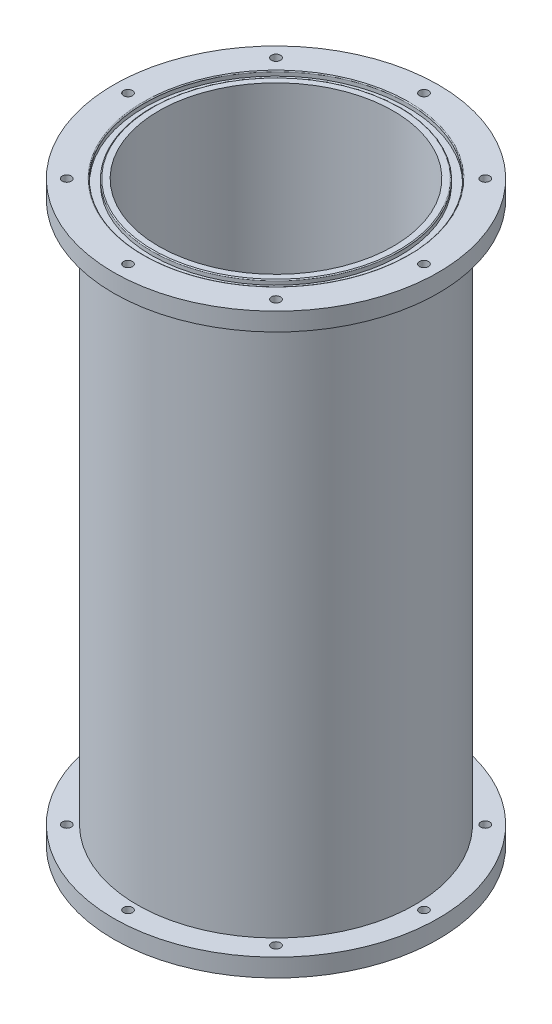
ISO-10303-21;
HEADER;
FILE_DESCRIPTION(('STEP AP214'),'2;1');
FILE_NAME('part.step','',(''),(''),'','','');
FILE_SCHEMA(('AUTOMOTIVE_DESIGN { 1 0 10303 214 1 1 1 1 }'));
ENDSEC;
DATA;
#1=APPLICATION_CONTEXT('core data for automotive mechanical design processes');
#2=APPLICATION_PROTOCOL_DEFINITION('international standard','automotive_design',2000,#1);
#3=PRODUCT_CONTEXT('',#1,'mechanical');
#4=PRODUCT('Part','Part','',(#3));
#5=PRODUCT_RELATED_PRODUCT_CATEGORY('part','',(#4));
#6=PRODUCT_DEFINITION_FORMATION('','',#4);
#7=PRODUCT_DEFINITION_CONTEXT('part definition',#1,'design');
#8=PRODUCT_DEFINITION('design','',#6,#7);
#9=PRODUCT_DEFINITION_SHAPE('','',#8);
#10=(LENGTH_UNIT() NAMED_UNIT(*) SI_UNIT(.MILLI.,.METRE.));
#11=(NAMED_UNIT(*) PLANE_ANGLE_UNIT() SI_UNIT($,.RADIAN.));
#12=(NAMED_UNIT(*) SI_UNIT($,.STERADIAN.) SOLID_ANGLE_UNIT());
#13=UNCERTAINTY_MEASURE_WITH_UNIT(LENGTH_MEASURE(1.E-05),#10,'distance_accuracy_value','');
#14=(GEOMETRIC_REPRESENTATION_CONTEXT(3) GLOBAL_UNCERTAINTY_ASSIGNED_CONTEXT((#13)) GLOBAL_UNIT_ASSIGNED_CONTEXT((#10,
#11,#12)) REPRESENTATION_CONTEXT('',''));
#15=CARTESIAN_POINT('',(0.,0.,0.));
#16=DIRECTION('',(0.,0.,1.));
#17=DIRECTION('',(1.,0.,0.));
#18=AXIS2_PLACEMENT_3D('',#15,#16,#17);
#19=CARTESIAN_POINT('',(0.,155.,0.));
#20=DIRECTION('',(0.,1.,0.));
#21=DIRECTION('',(0.,0.,-1.));
#22=AXIS2_PLACEMENT_3D('',#19,#20,#21);
#23=PLANE('',#22);
#24=CARTESIAN_POINT('',(41.,155.,0.));
#25=DIRECTION('',(0.,1.,0.));
#26=DIRECTION('',(0.,0.,1.));
#27=AXIS2_PLACEMENT_3D('',#24,#25,#26);
#28=CIRCLE('',#27,1.24999999999998);
#29=CARTESIAN_POINT('',(41.,155.,1.24999999999998));
#30=VERTEX_POINT('',#29);
#31=EDGE_CURVE('E272',#30,#30,#28,.F.);
#32=ORIENTED_EDGE('',*,*,#31,.F.);
#33=EDGE_LOOP('',(#32));
#34=FACE_BOUND('',#33,.T.);
#35=CARTESIAN_POINT('',(28.9913780286484,155.,28.9913780286485));
#36=DIRECTION('',(0.,1.,0.));
#37=DIRECTION('',(0.,0.,1.));
#38=AXIS2_PLACEMENT_3D('',#35,#36,#37);
#39=CIRCLE('',#38,1.24999999999998);
#40=CARTESIAN_POINT('',(28.9913780286484,155.,30.2413780286485));
#41=VERTEX_POINT('',#40);
#42=EDGE_CURVE('E264',#41,#41,#39,.F.);
#43=ORIENTED_EDGE('',*,*,#42,.F.);
#44=EDGE_LOOP('',(#43));
#45=FACE_BOUND('',#44,.T.);
#46=CARTESIAN_POINT('',(-28.9913780286486,155.,28.9913780286483));
#47=DIRECTION('',(0.,1.,0.));
#48=DIRECTION('',(0.,0.,1.));
#49=AXIS2_PLACEMENT_3D('',#46,#47,#48);
#50=CIRCLE('',#49,1.24999999999999);
#51=CARTESIAN_POINT('',(-28.9913780286486,155.,30.2413780286483));
#52=VERTEX_POINT('',#51);
#53=EDGE_CURVE('E248',#52,#52,#50,.F.);
#54=ORIENTED_EDGE('',*,*,#53,.F.);
#55=EDGE_LOOP('',(#54));
#56=FACE_BOUND('',#55,.T.);
#57=CARTESIAN_POINT('',(-28.9913780286482,155.,-28.9913780286487));
#58=DIRECTION('',(0.,1.,0.));
#59=DIRECTION('',(0.,0.,1.));
#60=AXIS2_PLACEMENT_3D('',#57,#58,#59);
#61=CIRCLE('',#60,1.24999999999998);
#62=CARTESIAN_POINT('',(-28.9913780286482,155.,-27.7413780286487));
#63=VERTEX_POINT('',#62);
#64=EDGE_CURVE('E232',#63,#63,#61,.F.);
#65=ORIENTED_EDGE('',*,*,#64,.F.);
#66=EDGE_LOOP('',(#65));
#67=FACE_BOUND('',#66,.T.);
#68=CARTESIAN_POINT('',(0.,155.,0.));
#69=DIRECTION('',(0.,1.,0.));
#70=DIRECTION('',(0.,0.,1.));
#71=AXIS2_PLACEMENT_3D('',#68,#69,#70);
#72=CIRCLE('',#71,38.5);
#73=CARTESIAN_POINT('',(0.,155.,38.5));
#74=VERTEX_POINT('',#73);
#75=EDGE_CURVE('E107',#74,#74,#72,.T.);
#76=ORIENTED_EDGE('',*,*,#75,.T.);
#77=EDGE_LOOP('',(#76));
#78=FACE_BOUND('',#77,.T.);
#79=CARTESIAN_POINT('',(0.,155.,0.));
#80=DIRECTION('',(0.,-1.,0.));
#81=DIRECTION('',(0.,0.,-1.));
#82=AXIS2_PLACEMENT_3D('',#79,#80,#81);
#83=CIRCLE('',#82,45.);
#84=CARTESIAN_POINT('',(0.,155.,-45.));
#85=VERTEX_POINT('',#84);
#86=EDGE_CURVE('E131',#85,#85,#83,.T.);
#87=ORIENTED_EDGE('',*,*,#86,.T.);
#88=EDGE_LOOP('',(#87));
#89=FACE_BOUND('',#88,.T.);
#90=CARTESIAN_POINT('',(28.9913780286488,155.,-28.9913780286481));
#91=DIRECTION('',(0.,1.,0.));
#92=DIRECTION('',(0.,0.,1.));
#93=AXIS2_PLACEMENT_3D('',#90,#91,#92);
#94=CIRCLE('',#93,1.24999999999998);
#95=CARTESIAN_POINT('',(28.9913780286488,155.,-27.7413780286481));
#96=VERTEX_POINT('',#95);
#97=EDGE_CURVE('E216',#96,#96,#94,.F.);
#98=ORIENTED_EDGE('',*,*,#97,.F.);
#99=EDGE_LOOP('',(#98));
#100=FACE_BOUND('',#99,.T.);
#101=CARTESIAN_POINT('',(4.29452204677705E-13,155.,-41.));
#102=DIRECTION('',(0.,1.,0.));
#103=DIRECTION('',(0.,0.,1.));
#104=AXIS2_PLACEMENT_3D('',#101,#102,#103);
#105=CIRCLE('',#104,1.24999999999998);
#106=CARTESIAN_POINT('',(4.29452204677705E-13,155.,-39.75));
#107=VERTEX_POINT('',#106);
#108=EDGE_CURVE('E224',#107,#107,#105,.F.);
#109=ORIENTED_EDGE('',*,*,#108,.F.);
#110=EDGE_LOOP('',(#109));
#111=FACE_BOUND('',#110,.T.);
#112=CARTESIAN_POINT('',(-41.,155.,-2.86301469785137E-13));
#113=DIRECTION('',(0.,1.,0.));
#114=DIRECTION('',(0.,0.,1.));
#115=AXIS2_PLACEMENT_3D('',#112,#113,#114);
#116=CIRCLE('',#115,1.24999999999998);
#117=CARTESIAN_POINT('',(-41.,155.,1.2499999999997));
#118=VERTEX_POINT('',#117);
#119=EDGE_CURVE('E240',#118,#118,#116,.F.);
#120=ORIENTED_EDGE('',*,*,#119,.F.);
#121=EDGE_LOOP('',(#120));
#122=FACE_BOUND('',#121,.T.);
#123=CARTESIAN_POINT('',(-1.43150734892568E-13,155.,41.));
#124=DIRECTION('',(0.,1.,0.));
#125=DIRECTION('',(0.,0.,1.));
#126=AXIS2_PLACEMENT_3D('',#123,#124,#125);
#127=CIRCLE('',#126,1.24999999999998);
#128=CARTESIAN_POINT('',(-1.43150734892568E-13,155.,42.25));
#129=VERTEX_POINT('',#128);
#130=EDGE_CURVE('E256',#129,#129,#127,.F.);
#131=ORIENTED_EDGE('',*,*,#130,.F.);
#132=EDGE_LOOP('',(#131));
#133=FACE_BOUND('',#132,.T.);
#134=ADVANCED_FACE('F63',(#34,#45,#56,#67,#78,#89,#100,#111,#122,#133),#23,.F.);
#135=CARTESIAN_POINT('',(0.,0.,0.));
#136=DIRECTION('',(0.,1.,0.));
#137=DIRECTION('',(0.,0.,1.));
#138=AXIS2_PLACEMENT_3D('',#135,#136,#137);
#139=PLANE('',#138);
#140=CARTESIAN_POINT('',(41.,0.,0.));
#141=DIRECTION('',(0.,-1.,0.));
#142=DIRECTION('',(0.,0.,-1.));
#143=AXIS2_PLACEMENT_3D('',#140,#141,#142);
#144=CIRCLE('',#143,1.24999999999999);
#145=CARTESIAN_POINT('',(41.,0.,-1.24999999999999));
#146=VERTEX_POINT('',#145);
#147=EDGE_CURVE('E212',#146,#146,#144,.T.);
#148=ORIENTED_EDGE('',*,*,#147,.F.);
#149=EDGE_LOOP('',(#148));
#150=FACE_BOUND('',#149,.T.);
#151=CARTESIAN_POINT('',(28.9913780286484,0.,-28.9913780286485));
#152=DIRECTION('',(0.,-1.,0.));
#153=DIRECTION('',(0.,0.,-1.));
#154=AXIS2_PLACEMENT_3D('',#151,#152,#153);
#155=CIRCLE('',#154,1.24999999999999);
#156=CARTESIAN_POINT('',(28.9913780286484,0.,-30.2413780286485));
#157=VERTEX_POINT('',#156);
#158=EDGE_CURVE('E204',#157,#157,#155,.T.);
#159=ORIENTED_EDGE('',*,*,#158,.F.);
#160=EDGE_LOOP('',(#159));
#161=FACE_BOUND('',#160,.T.);
#162=CARTESIAN_POINT('',(-1.43150734892568E-13,0.,-41.));
#163=DIRECTION('',(0.,-1.,0.));
#164=DIRECTION('',(0.,0.,-1.));
#165=AXIS2_PLACEMENT_3D('',#162,#163,#164);
#166=CIRCLE('',#165,1.24999999999999);
#167=CARTESIAN_POINT('',(-1.43150734892568E-13,0.,-42.25));
#168=VERTEX_POINT('',#167);
#169=EDGE_CURVE('E196',#168,#168,#166,.T.);
#170=ORIENTED_EDGE('',*,*,#169,.F.);
#171=EDGE_LOOP('',(#170));
#172=FACE_BOUND('',#171,.T.);
#173=CARTESIAN_POINT('',(-28.9913780286486,0.,-28.9913780286483));
#174=DIRECTION('',(0.,-1.,0.));
#175=DIRECTION('',(0.,0.,-1.));
#176=AXIS2_PLACEMENT_3D('',#173,#174,#175);
#177=CIRCLE('',#176,1.24999999999999);
#178=CARTESIAN_POINT('',(-28.9913780286486,0.,-30.2413780286483));
#179=VERTEX_POINT('',#178);
#180=EDGE_CURVE('E188',#179,#179,#177,.T.);
#181=ORIENTED_EDGE('',*,*,#180,.F.);
#182=EDGE_LOOP('',(#181));
#183=FACE_BOUND('',#182,.T.);
#184=CARTESIAN_POINT('',(-41.,0.,2.86301469785137E-13));
#185=DIRECTION('',(0.,-1.,0.));
#186=DIRECTION('',(0.,0.,-1.));
#187=AXIS2_PLACEMENT_3D('',#184,#185,#186);
#188=CIRCLE('',#187,1.24999999999999);
#189=CARTESIAN_POINT('',(-41.,0.,-1.2499999999997));
#190=VERTEX_POINT('',#189);
#191=EDGE_CURVE('E180',#190,#190,#188,.T.);
#192=ORIENTED_EDGE('',*,*,#191,.F.);
#193=EDGE_LOOP('',(#192));
#194=FACE_BOUND('',#193,.T.);
#195=CARTESIAN_POINT('',(-28.9913780286482,0.,28.9913780286487));
#196=DIRECTION('',(0.,-1.,0.));
#197=DIRECTION('',(0.,0.,-1.));
#198=AXIS2_PLACEMENT_3D('',#195,#196,#197);
#199=CIRCLE('',#198,1.24999999999999);
#200=CARTESIAN_POINT('',(-28.9913780286482,0.,27.7413780286487));
#201=VERTEX_POINT('',#200);
#202=EDGE_CURVE('E172',#201,#201,#199,.T.);
#203=ORIENTED_EDGE('',*,*,#202,.F.);
#204=EDGE_LOOP('',(#203));
#205=FACE_BOUND('',#204,.T.);
#206=CARTESIAN_POINT('',(4.29452204677705E-13,0.,41.));
#207=DIRECTION('',(0.,-1.,0.));
#208=DIRECTION('',(0.,0.,-1.));
#209=AXIS2_PLACEMENT_3D('',#206,#207,#208);
#210=CIRCLE('',#209,1.24999999999999);
#211=CARTESIAN_POINT('',(4.29452204677705E-13,0.,39.75));
#212=VERTEX_POINT('',#211);
#213=EDGE_CURVE('E164',#212,#212,#210,.T.);
#214=ORIENTED_EDGE('',*,*,#213,.F.);
#215=EDGE_LOOP('',(#214));
#216=FACE_BOUND('',#215,.T.);
#217=CARTESIAN_POINT('',(0.,0.,0.));
#218=DIRECTION('',(0.,1.,0.));
#219=DIRECTION('',(0.,0.,1.));
#220=AXIS2_PLACEMENT_3D('',#217,#218,#219);
#221=CIRCLE('',#220,36.8173);
#222=CARTESIAN_POINT('',(0.,0.,36.8173));
#223=VERTEX_POINT('',#222);
#224=EDGE_CURVE('E91',#223,#223,#221,.T.);
#225=ORIENTED_EDGE('',*,*,#224,.T.);
#226=EDGE_LOOP('',(#225));
#227=FACE_BOUND('',#226,.T.);
#228=CARTESIAN_POINT('',(0.,0.,0.));
#229=DIRECTION('',(0.,-1.,0.));
#230=DIRECTION('',(0.,0.,-1.));
#231=AXIS2_PLACEMENT_3D('',#228,#229,#230);
#232=CIRCLE('',#231,45.);
#233=CARTESIAN_POINT('',(0.,0.,-45.));
#234=VERTEX_POINT('',#233);
#235=EDGE_CURVE('E120',#234,#234,#232,.T.);
#236=ORIENTED_EDGE('',*,*,#235,.T.);
#237=EDGE_LOOP('',(#236));
#238=FACE_BOUND('',#237,.T.);
#239=CARTESIAN_POINT('',(28.9913780286488,0.,28.9913780286481));
#240=DIRECTION('',(0.,-1.,0.));
#241=DIRECTION('',(0.,0.,-1.));
#242=AXIS2_PLACEMENT_3D('',#239,#240,#241);
#243=CIRCLE('',#242,1.24999999999999);
#244=CARTESIAN_POINT('',(28.9913780286488,0.,27.7413780286481));
#245=VERTEX_POINT('',#244);
#246=EDGE_CURVE('E156',#245,#245,#243,.T.);
#247=ORIENTED_EDGE('',*,*,#246,.F.);
#248=EDGE_LOOP('',(#247));
#249=FACE_BOUND('',#248,.T.);
#250=ADVANCED_FACE('F291',(#150,#161,#172,#183,#194,#205,#216,#227,#238,#249),#139,.F.);
#251=CARTESIAN_POINT('',(0.,5.,0.));
#252=DIRECTION('',(0.,-1.,0.));
#253=DIRECTION('',(0.,0.,-1.));
#254=AXIS2_PLACEMENT_3D('',#251,#252,#253);
#255=PLANE('',#254);
#256=CARTESIAN_POINT('',(41.,5.,0.));
#257=DIRECTION('',(0.,-1.,0.));
#258=DIRECTION('',(0.,0.,-1.));
#259=AXIS2_PLACEMENT_3D('',#256,#257,#258);
#260=CIRCLE('',#259,1.24999999999998);
#261=CARTESIAN_POINT('',(41.,5.,-1.24999999999998));
#262=VERTEX_POINT('',#261);
#263=EDGE_CURVE('E208',#262,#262,#260,.F.);
#264=ORIENTED_EDGE('',*,*,#263,.F.);
#265=EDGE_LOOP('',(#264));
#266=FACE_BOUND('',#265,.T.);
#267=CARTESIAN_POINT('',(28.9913780286484,5.,-28.9913780286485));
#268=DIRECTION('',(0.,-1.,0.));
#269=DIRECTION('',(0.,0.,-1.));
#270=AXIS2_PLACEMENT_3D('',#267,#268,#269);
#271=CIRCLE('',#270,1.24999999999998);
#272=CARTESIAN_POINT('',(28.9913780286484,5.,-30.2413780286485));
#273=VERTEX_POINT('',#272);
#274=EDGE_CURVE('E200',#273,#273,#271,.F.);
#275=ORIENTED_EDGE('',*,*,#274,.F.);
#276=EDGE_LOOP('',(#275));
#277=FACE_BOUND('',#276,.T.);
#278=CARTESIAN_POINT('',(-1.43150734892568E-13,5.,-41.));
#279=DIRECTION('',(0.,-1.,0.));
#280=DIRECTION('',(0.,0.,-1.));
#281=AXIS2_PLACEMENT_3D('',#278,#279,#280);
#282=CIRCLE('',#281,1.24999999999998);
#283=CARTESIAN_POINT('',(-1.43150734892568E-13,5.,-42.25));
#284=VERTEX_POINT('',#283);
#285=EDGE_CURVE('E192',#284,#284,#282,.F.);
#286=ORIENTED_EDGE('',*,*,#285,.F.);
#287=EDGE_LOOP('',(#286));
#288=FACE_BOUND('',#287,.T.);
#289=CARTESIAN_POINT('',(-28.9913780286486,5.,-28.9913780286483));
#290=DIRECTION('',(0.,-1.,0.));
#291=DIRECTION('',(0.,0.,-1.));
#292=AXIS2_PLACEMENT_3D('',#289,#290,#291);
#293=CIRCLE('',#292,1.24999999999999);
#294=CARTESIAN_POINT('',(-28.9913780286486,5.,-30.2413780286483));
#295=VERTEX_POINT('',#294);
#296=EDGE_CURVE('E184',#295,#295,#293,.F.);
#297=ORIENTED_EDGE('',*,*,#296,.F.);
#298=EDGE_LOOP('',(#297));
#299=FACE_BOUND('',#298,.T.);
#300=CARTESIAN_POINT('',(-41.,5.,2.86301469785137E-13));
#301=DIRECTION('',(0.,-1.,0.));
#302=DIRECTION('',(0.,0.,-1.));
#303=AXIS2_PLACEMENT_3D('',#300,#301,#302);
#304=CIRCLE('',#303,1.24999999999998);
#305=CARTESIAN_POINT('',(-41.,5.,-1.2499999999997));
#306=VERTEX_POINT('',#305);
#307=EDGE_CURVE('E176',#306,#306,#304,.F.);
#308=ORIENTED_EDGE('',*,*,#307,.F.);
#309=EDGE_LOOP('',(#308));
#310=FACE_BOUND('',#309,.T.);
#311=CARTESIAN_POINT('',(-28.9913780286482,5.,28.9913780286487));
#312=DIRECTION('',(0.,-1.,0.));
#313=DIRECTION('',(0.,0.,-1.));
#314=AXIS2_PLACEMENT_3D('',#311,#312,#313);
#315=CIRCLE('',#314,1.24999999999998);
#316=CARTESIAN_POINT('',(-28.9913780286482,5.,27.7413780286487));
#317=VERTEX_POINT('',#316);
#318=EDGE_CURVE('E168',#317,#317,#315,.F.);
#319=ORIENTED_EDGE('',*,*,#318,.F.);
#320=EDGE_LOOP('',(#319));
#321=FACE_BOUND('',#320,.T.);
#322=CARTESIAN_POINT('',(4.29452204677705E-13,5.,41.));
#323=DIRECTION('',(0.,-1.,0.));
#324=DIRECTION('',(0.,0.,-1.));
#325=AXIS2_PLACEMENT_3D('',#322,#323,#324);
#326=CIRCLE('',#325,1.24999999999998);
#327=CARTESIAN_POINT('',(4.29452204677705E-13,5.,39.75));
#328=VERTEX_POINT('',#327);
#329=EDGE_CURVE('E160',#328,#328,#326,.F.);
#330=ORIENTED_EDGE('',*,*,#329,.F.);
#331=EDGE_LOOP('',(#330));
#332=FACE_BOUND('',#331,.T.);
#333=CARTESIAN_POINT('',(0.,5.,0.));
#334=DIRECTION('',(0.,-1.,0.));
#335=DIRECTION('',(0.,0.,-1.));
#336=AXIS2_PLACEMENT_3D('',#333,#334,#335);
#337=CIRCLE('',#336,38.5);
#338=CARTESIAN_POINT('',(0.,5.,-38.5));
#339=VERTEX_POINT('',#338);
#340=EDGE_CURVE('E111',#339,#339,#337,.T.);
#341=ORIENTED_EDGE('',*,*,#340,.T.);
#342=EDGE_LOOP('',(#341));
#343=FACE_BOUND('',#342,.T.);
#344=CARTESIAN_POINT('',(0.,5.,0.));
#345=DIRECTION('',(0.,-1.,0.));
#346=DIRECTION('',(0.,0.,-1.));
#347=AXIS2_PLACEMENT_3D('',#344,#345,#346);
#348=CIRCLE('',#347,45.);
#349=CARTESIAN_POINT('',(0.,5.,-45.));
#350=VERTEX_POINT('',#349);
#351=EDGE_CURVE('E119',#350,#350,#348,.T.);
#352=ORIENTED_EDGE('',*,*,#351,.F.);
#353=EDGE_LOOP('',(#352));
#354=FACE_BOUND('',#353,.T.);
#355=CARTESIAN_POINT('',(28.9913780286488,5.,28.9913780286481));
#356=DIRECTION('',(0.,-1.,0.));
#357=DIRECTION('',(0.,0.,-1.));
#358=AXIS2_PLACEMENT_3D('',#355,#356,#357);
#359=CIRCLE('',#358,1.24999999999998);
#360=CARTESIAN_POINT('',(28.9913780286488,5.,27.7413780286481));
#361=VERTEX_POINT('',#360);
#362=EDGE_CURVE('E155',#361,#361,#359,.F.);
#363=ORIENTED_EDGE('',*,*,#362,.F.);
#364=EDGE_LOOP('',(#363));
#365=FACE_BOUND('',#364,.T.);
#366=ADVANCED_FACE('F352',(#266,#277,#288,#299,#310,#321,#332,#343,#354,#365),#255,.F.);
#367=CARTESIAN_POINT('',(0.,0.,0.));
#368=DIRECTION('',(0.,1.,0.));
#369=DIRECTION('',(0.,0.,1.));
#370=AXIS2_PLACEMENT_3D('',#367,#368,#369);
#371=CIRCLE('',#370,34.1503);
#372=CARTESIAN_POINT('',(0.,0.,34.1503));
#373=VERTEX_POINT('',#372);
#374=EDGE_CURVE('E103',#373,#373,#371,.F.);
#375=ORIENTED_EDGE('',*,*,#374,.T.);
#376=EDGE_LOOP('',(#375));
#377=FACE_BOUND('',#376,.T.);
#378=CARTESIAN_POINT('',(0.,0.,0.));
#379=DIRECTION('',(0.,1.,0.));
#380=DIRECTION('',(0.,0.,1.));
#381=AXIS2_PLACEMENT_3D('',#378,#379,#380);
#382=CIRCLE('',#381,32.5);
#383=CARTESIAN_POINT('',(0.,0.,32.5));
#384=VERTEX_POINT('',#383);
#385=EDGE_CURVE('E115',#384,#384,#382,.T.);
#386=ORIENTED_EDGE('',*,*,#385,.T.);
#387=EDGE_LOOP('',(#386));
#388=FACE_BOUND('',#387,.T.);
#389=ADVANCED_FACE('F355',(#377,#388),#139,.F.);
#390=CARTESIAN_POINT('',(0.,160.,0.));
#391=DIRECTION('',(0.,-1.,0.));
#392=DIRECTION('',(0.,0.,1.));
#393=AXIS2_PLACEMENT_3D('',#390,#391,#392);
#394=PLANE('',#393);
#395=CARTESIAN_POINT('',(0.,160.,0.));
#396=DIRECTION('',(0.,-1.,0.));
#397=DIRECTION('',(0.,0.,-1.));
#398=AXIS2_PLACEMENT_3D('',#395,#396,#397);
#399=CIRCLE('',#398,34.1503);
#400=CARTESIAN_POINT('',(0.,160.,-34.1503));
#401=VERTEX_POINT('',#400);
#402=EDGE_CURVE('E85',#401,#401,#399,.F.);
#403=ORIENTED_EDGE('',*,*,#402,.T.);
#404=EDGE_LOOP('',(#403));
#405=FACE_BOUND('',#404,.T.);
#406=CARTESIAN_POINT('',(0.,160.,0.));
#407=DIRECTION('',(0.,1.,0.));
#408=DIRECTION('',(0.,0.,1.));
#409=AXIS2_PLACEMENT_3D('',#406,#407,#408);
#410=CIRCLE('',#409,32.5);
#411=CARTESIAN_POINT('',(0.,160.,32.5));
#412=VERTEX_POINT('',#411);
#413=EDGE_CURVE('E124',#412,#412,#410,.T.);
#414=ORIENTED_EDGE('',*,*,#413,.F.);
#415=EDGE_LOOP('',(#414));
#416=FACE_BOUND('',#415,.T.);
#417=ADVANCED_FACE('F326',(#405,#416),#394,.F.);
#418=CARTESIAN_POINT('',(0.,160.,0.));
#419=DIRECTION('',(0.,-1.,0.));
#420=DIRECTION('',(0.,0.,-1.));
#421=AXIS2_PLACEMENT_3D('',#418,#419,#420);
#422=CYLINDRICAL_SURFACE('',#421,38.5);
#423=ORIENTED_EDGE('',*,*,#340,.F.);
#424=EDGE_LOOP('',(#423));
#425=FACE_BOUND('',#424,.T.);
#426=ORIENTED_EDGE('',*,*,#75,.F.);
#427=EDGE_LOOP('',(#426));
#428=FACE_BOUND('',#427,.T.);
#429=ADVANCED_FACE('F358',(#425,#428),#422,.T.);
#430=CARTESIAN_POINT('',(0.,5.,0.));
#431=DIRECTION('',(0.,-1.,0.));
#432=DIRECTION('',(0.,0.,-1.));
#433=AXIS2_PLACEMENT_3D('',#430,#431,#432);
#434=CYLINDRICAL_SURFACE('',#433,45.);
#435=ORIENTED_EDGE('',*,*,#351,.T.);
#436=EDGE_LOOP('',(#435));
#437=FACE_BOUND('',#436,.T.);
#438=ORIENTED_EDGE('',*,*,#235,.F.);
#439=EDGE_LOOP('',(#438));
#440=FACE_BOUND('',#439,.T.);
#441=ADVANCED_FACE('F323',(#437,#440),#434,.T.);
#442=CARTESIAN_POINT('',(41.,160.,0.));
#443=DIRECTION('',(0.,1.,0.));
#444=DIRECTION('',(0.,0.,1.));
#445=AXIS2_PLACEMENT_3D('',#442,#443,#444);
#446=CIRCLE('',#445,1.24999999999999);
#447=CARTESIAN_POINT('',(41.,160.,1.24999999999999));
#448=VERTEX_POINT('',#447);
#449=EDGE_CURVE('E276',#448,#448,#446,.T.);
#450=ORIENTED_EDGE('',*,*,#449,.F.);
#451=EDGE_LOOP('',(#450));
#452=FACE_BOUND('',#451,.T.);
#453=CARTESIAN_POINT('',(28.9913780286484,160.,28.9913780286485));
#454=DIRECTION('',(0.,1.,0.));
#455=DIRECTION('',(0.,0.,1.));
#456=AXIS2_PLACEMENT_3D('',#453,#454,#455);
#457=CIRCLE('',#456,1.24999999999999);
#458=CARTESIAN_POINT('',(28.9913780286484,160.,30.2413780286485));
#459=VERTEX_POINT('',#458);
#460=EDGE_CURVE('E268',#459,#459,#457,.T.);
#461=ORIENTED_EDGE('',*,*,#460,.F.);
#462=EDGE_LOOP('',(#461));
#463=FACE_BOUND('',#462,.T.);
#464=CARTESIAN_POINT('',(-1.43150734892568E-13,160.,41.));
#465=DIRECTION('',(0.,1.,0.));
#466=DIRECTION('',(0.,0.,1.));
#467=AXIS2_PLACEMENT_3D('',#464,#465,#466);
#468=CIRCLE('',#467,1.24999999999999);
#469=CARTESIAN_POINT('',(-1.43150734892568E-13,160.,42.25));
#470=VERTEX_POINT('',#469);
#471=EDGE_CURVE('E260',#470,#470,#468,.T.);
#472=ORIENTED_EDGE('',*,*,#471,.F.);
#473=EDGE_LOOP('',(#472));
#474=FACE_BOUND('',#473,.T.);
#475=CARTESIAN_POINT('',(-28.9913780286486,160.,28.9913780286483));
#476=DIRECTION('',(0.,1.,0.));
#477=DIRECTION('',(0.,0.,1.));
#478=AXIS2_PLACEMENT_3D('',#475,#476,#477);
#479=CIRCLE('',#478,1.24999999999999);
#480=CARTESIAN_POINT('',(-28.9913780286486,160.,30.2413780286483));
#481=VERTEX_POINT('',#480);
#482=EDGE_CURVE('E252',#481,#481,#479,.T.);
#483=ORIENTED_EDGE('',*,*,#482,.F.);
#484=EDGE_LOOP('',(#483));
#485=FACE_BOUND('',#484,.T.);
#486=CARTESIAN_POINT('',(-41.,160.,-2.86301469785137E-13));
#487=DIRECTION('',(0.,1.,0.));
#488=DIRECTION('',(0.,0.,1.));
#489=AXIS2_PLACEMENT_3D('',#486,#487,#488);
#490=CIRCLE('',#489,1.24999999999999);
#491=CARTESIAN_POINT('',(-41.,160.,1.2499999999997));
#492=VERTEX_POINT('',#491);
#493=EDGE_CURVE('E244',#492,#492,#490,.T.);
#494=ORIENTED_EDGE('',*,*,#493,.F.);
#495=EDGE_LOOP('',(#494));
#496=FACE_BOUND('',#495,.T.);
#497=CARTESIAN_POINT('',(-28.9913780286482,160.,-28.9913780286487));
#498=DIRECTION('',(0.,1.,0.));
#499=DIRECTION('',(0.,0.,1.));
#500=AXIS2_PLACEMENT_3D('',#497,#498,#499);
#501=CIRCLE('',#500,1.24999999999999);
#502=CARTESIAN_POINT('',(-28.9913780286482,160.,-27.7413780286487));
#503=VERTEX_POINT('',#502);
#504=EDGE_CURVE('E236',#503,#503,#501,.T.);
#505=ORIENTED_EDGE('',*,*,#504,.F.);
#506=EDGE_LOOP('',(#505));
#507=FACE_BOUND('',#506,.T.);
#508=CARTESIAN_POINT('',(4.29452204677705E-13,160.,-41.));
#509=DIRECTION('',(0.,1.,0.));
#510=DIRECTION('',(0.,0.,1.));
#511=AXIS2_PLACEMENT_3D('',#508,#509,#510);
#512=CIRCLE('',#511,1.24999999999999);
#513=CARTESIAN_POINT('',(4.29452204677705E-13,160.,-39.75));
#514=VERTEX_POINT('',#513);
#515=EDGE_CURVE('E228',#514,#514,#512,.T.);
#516=ORIENTED_EDGE('',*,*,#515,.F.);
#517=EDGE_LOOP('',(#516));
#518=FACE_BOUND('',#517,.T.);
#519=CARTESIAN_POINT('',(28.9913780286488,160.,-28.9913780286481));
#520=DIRECTION('',(0.,1.,0.));
#521=DIRECTION('',(0.,0.,1.));
#522=AXIS2_PLACEMENT_3D('',#519,#520,#521);
#523=CIRCLE('',#522,1.24999999999999);
#524=CARTESIAN_POINT('',(28.9913780286488,160.,-27.7413780286481));
#525=VERTEX_POINT('',#524);
#526=EDGE_CURVE('E220',#525,#525,#523,.T.);
#527=ORIENTED_EDGE('',*,*,#526,.F.);
#528=EDGE_LOOP('',(#527));
#529=FACE_BOUND('',#528,.T.);
#530=CARTESIAN_POINT('',(0.,160.,0.));
#531=DIRECTION('',(0.,-1.,0.));
#532=DIRECTION('',(0.,0.,-1.));
#533=AXIS2_PLACEMENT_3D('',#530,#531,#532);
#534=CIRCLE('',#533,36.8173);
#535=CARTESIAN_POINT('',(0.,160.,-36.8173));
#536=VERTEX_POINT('',#535);
#537=EDGE_CURVE('E12',#536,#536,#534,.T.);
#538=ORIENTED_EDGE('',*,*,#537,.T.);
#539=EDGE_LOOP('',(#538));
#540=FACE_BOUND('',#539,.T.);
#541=CARTESIAN_POINT('',(0.,160.,0.));
#542=DIRECTION('',(0.,-1.,0.));
#543=DIRECTION('',(0.,0.,-1.));
#544=AXIS2_PLACEMENT_3D('',#541,#542,#543);
#545=CIRCLE('',#544,45.);
#546=CARTESIAN_POINT('',(0.,160.,-45.));
#547=VERTEX_POINT('',#546);
#548=EDGE_CURVE('E132',#547,#547,#545,.T.);
#549=ORIENTED_EDGE('',*,*,#548,.F.);
#550=EDGE_LOOP('',(#549));
#551=FACE_BOUND('',#550,.T.);
#552=ADVANCED_FACE('F319',(#452,#463,#474,#485,#496,#507,#518,#529,#540,#551),#394,.F.);
#553=CARTESIAN_POINT('',(0.,155.,0.));
#554=DIRECTION('',(0.,1.,0.));
#555=DIRECTION('',(0.,0.,1.));
#556=AXIS2_PLACEMENT_3D('',#553,#554,#555);
#557=CYLINDRICAL_SURFACE('',#556,45.);
#558=ORIENTED_EDGE('',*,*,#86,.F.);
#559=EDGE_LOOP('',(#558));
#560=FACE_BOUND('',#559,.T.);
#561=ORIENTED_EDGE('',*,*,#548,.T.);
#562=EDGE_LOOP('',(#561));
#563=FACE_BOUND('',#562,.T.);
#564=ADVANCED_FACE('F322',(#560,#563),#557,.T.);
#565=CARTESIAN_POINT('',(0.,160.,0.));
#566=DIRECTION('',(0.,-1.,0.));
#567=DIRECTION('',(0.,0.,-1.));
#568=AXIS2_PLACEMENT_3D('',#565,#566,#567);
#569=CYLINDRICAL_SURFACE('',#568,32.5);
#570=ORIENTED_EDGE('',*,*,#385,.F.);
#571=EDGE_LOOP('',(#570));
#572=FACE_BOUND('',#571,.T.);
#573=ORIENTED_EDGE('',*,*,#413,.T.);
#574=EDGE_LOOP('',(#573));
#575=FACE_BOUND('',#574,.T.);
#576=ADVANCED_FACE('F340',(#572,#575),#569,.F.);
#577=CARTESIAN_POINT('',(0.,158.73,0.));
#578=DIRECTION('',(0.,1.,0.));
#579=DIRECTION('',(0.,0.,1.));
#580=AXIS2_PLACEMENT_3D('',#577,#578,#579);
#581=CYLINDRICAL_SURFACE('',#580,36.5633);
#582=CARTESIAN_POINT('',(0.,159.746,0.));
#583=DIRECTION('',(0.,-1.,0.));
#584=DIRECTION('',(0.,0.,-1.));
#585=AXIS2_PLACEMENT_3D('',#582,#583,#584);
#586=CIRCLE('',#585,36.5633);
#587=CARTESIAN_POINT('',(0.,159.746,-36.5633));
#588=VERTEX_POINT('',#587);
#589=EDGE_CURVE('E71',#588,#588,#586,.F.);
#590=ORIENTED_EDGE('',*,*,#589,.T.);
#591=EDGE_LOOP('',(#590));
#592=FACE_BOUND('',#591,.T.);
#593=CARTESIAN_POINT('',(0.,158.73,0.));
#594=DIRECTION('',(0.,1.,0.));
#595=DIRECTION('',(0.,0.,1.));
#596=AXIS2_PLACEMENT_3D('',#593,#594,#595);
#597=CIRCLE('',#596,36.5633);
#598=CARTESIAN_POINT('',(0.,158.73,36.5633));
#599=VERTEX_POINT('',#598);
#600=EDGE_CURVE('E136',#599,#599,#597,.T.);
#601=ORIENTED_EDGE('',*,*,#600,.F.);
#602=EDGE_LOOP('',(#601));
#603=FACE_BOUND('',#602,.T.);
#604=ADVANCED_FACE('F347',(#592,#603),#581,.F.);
#605=CARTESIAN_POINT('',(0.,158.73,0.));
#606=DIRECTION('',(0.,1.,0.));
#607=DIRECTION('',(0.,0.,1.));
#608=AXIS2_PLACEMENT_3D('',#605,#606,#607);
#609=PLANE('',#608);
#610=CARTESIAN_POINT('',(0.,158.73,0.));
#611=DIRECTION('',(0.,1.,0.));
#612=DIRECTION('',(0.,0.,1.));
#613=AXIS2_PLACEMENT_3D('',#610,#611,#612);
#614=CIRCLE('',#613,34.4043);
#615=CARTESIAN_POINT('',(0.,158.73,34.4043));
#616=VERTEX_POINT('',#615);
#617=EDGE_CURVE('E143',#616,#616,#614,.T.);
#618=ORIENTED_EDGE('',*,*,#617,.F.);
#619=EDGE_LOOP('',(#618));
#620=FACE_BOUND('',#619,.T.);
#621=ORIENTED_EDGE('',*,*,#600,.T.);
#622=EDGE_LOOP('',(#621));
#623=FACE_BOUND('',#622,.T.);
#624=ADVANCED_FACE('F418',(#620,#623),#609,.T.);
#625=CARTESIAN_POINT('',(0.,158.73,0.));
#626=DIRECTION('',(0.,1.,0.));
#627=DIRECTION('',(0.,0.,1.));
#628=AXIS2_PLACEMENT_3D('',#625,#626,#627);
#629=CYLINDRICAL_SURFACE('',#628,34.4043);
#630=CARTESIAN_POINT('',(0.,159.746,0.));
#631=DIRECTION('',(0.,-1.,0.));
#632=DIRECTION('',(0.,0.,-1.));
#633=AXIS2_PLACEMENT_3D('',#630,#631,#632);
#634=CIRCLE('',#633,34.4043);
#635=CARTESIAN_POINT('',(0.,159.746,-34.4043));
#636=VERTEX_POINT('',#635);
#637=EDGE_CURVE('E78',#636,#636,#634,.T.);
#638=ORIENTED_EDGE('',*,*,#637,.T.);
#639=EDGE_LOOP('',(#638));
#640=FACE_BOUND('',#639,.T.);
#641=ORIENTED_EDGE('',*,*,#617,.T.);
#642=EDGE_LOOP('',(#641));
#643=FACE_BOUND('',#642,.T.);
#644=ADVANCED_FACE('F421',(#640,#643),#629,.T.);
#645=CARTESIAN_POINT('',(0.,1.27,0.));
#646=DIRECTION('',(0.,-1.,0.));
#647=DIRECTION('',(0.,0.,-1.));
#648=AXIS2_PLACEMENT_3D('',#645,#646,#647);
#649=CYLINDRICAL_SURFACE('',#648,36.5633);
#650=CARTESIAN_POINT('',(0.,0.254,0.));
#651=DIRECTION('',(0.,1.,0.));
#652=DIRECTION('',(0.,0.,1.));
#653=AXIS2_PLACEMENT_3D('',#650,#651,#652);
#654=CIRCLE('',#653,36.5633);
#655=CARTESIAN_POINT('',(0.,0.254,36.5633));
#656=VERTEX_POINT('',#655);
#657=EDGE_CURVE('E95',#656,#656,#654,.F.);
#658=ORIENTED_EDGE('',*,*,#657,.T.);
#659=EDGE_LOOP('',(#658));
#660=FACE_BOUND('',#659,.T.);
#661=CARTESIAN_POINT('',(0.,1.27,0.));
#662=DIRECTION('',(0.,-1.,0.));
#663=DIRECTION('',(0.,0.,-1.));
#664=AXIS2_PLACEMENT_3D('',#661,#662,#663);
#665=CIRCLE('',#664,36.5633);
#666=CARTESIAN_POINT('',(0.,1.27,-36.5633));
#667=VERTEX_POINT('',#666);
#668=EDGE_CURVE('E147',#667,#667,#665,.T.);
#669=ORIENTED_EDGE('',*,*,#668,.F.);
#670=EDGE_LOOP('',(#669));
#671=FACE_BOUND('',#670,.T.);
#672=ADVANCED_FACE('F410',(#660,#671),#649,.F.);
#673=CARTESIAN_POINT('',(0.,1.27,0.));
#674=DIRECTION('',(0.,-1.,0.));
#675=DIRECTION('',(0.,0.,-1.));
#676=AXIS2_PLACEMENT_3D('',#673,#674,#675);
#677=PLANE('',#676);
#678=CARTESIAN_POINT('',(0.,1.27,0.));
#679=DIRECTION('',(0.,-1.,0.));
#680=DIRECTION('',(0.,0.,-1.));
#681=AXIS2_PLACEMENT_3D('',#678,#679,#680);
#682=CIRCLE('',#681,34.4043);
#683=CARTESIAN_POINT('',(0.,1.27,-34.4043));
#684=VERTEX_POINT('',#683);
#685=EDGE_CURVE('E151',#684,#684,#682,.T.);
#686=ORIENTED_EDGE('',*,*,#685,.F.);
#687=EDGE_LOOP('',(#686));
#688=FACE_BOUND('',#687,.T.);
#689=ORIENTED_EDGE('',*,*,#668,.T.);
#690=EDGE_LOOP('',(#689));
#691=FACE_BOUND('',#690,.T.);
#692=ADVANCED_FACE('F407',(#688,#691),#677,.T.);
#693=CARTESIAN_POINT('',(0.,1.27,0.));
#694=DIRECTION('',(0.,-1.,0.));
#695=DIRECTION('',(0.,0.,-1.));
#696=AXIS2_PLACEMENT_3D('',#693,#694,#695);
#697=CYLINDRICAL_SURFACE('',#696,34.4043);
#698=CARTESIAN_POINT('',(0.,0.254,0.));
#699=DIRECTION('',(0.,1.,0.));
#700=DIRECTION('',(0.,0.,1.));
#701=AXIS2_PLACEMENT_3D('',#698,#699,#700);
#702=CIRCLE('',#701,34.4043);
#703=CARTESIAN_POINT('',(0.,0.254,34.4043));
#704=VERTEX_POINT('',#703);
#705=EDGE_CURVE('E99',#704,#704,#702,.T.);
#706=ORIENTED_EDGE('',*,*,#705,.T.);
#707=EDGE_LOOP('',(#706));
#708=FACE_BOUND('',#707,.T.);
#709=ORIENTED_EDGE('',*,*,#685,.T.);
#710=EDGE_LOOP('',(#709));
#711=FACE_BOUND('',#710,.T.);
#712=ADVANCED_FACE('F371',(#708,#711),#697,.T.);
#713=CARTESIAN_POINT('',(0.,0.254,0.));
#714=DIRECTION('',(0.,1.,0.));
#715=DIRECTION('',(0.,0.,1.));
#716=AXIS2_PLACEMENT_3D('',#713,#714,#715);
#717=TOROIDAL_SURFACE('',#716,34.1503,0.254);
#718=ORIENTED_EDGE('',*,*,#705,.F.);
#719=EDGE_LOOP('',(#718));
#720=FACE_BOUND('',#719,.T.);
#721=ORIENTED_EDGE('',*,*,#374,.F.);
#722=EDGE_LOOP('',(#721));
#723=FACE_BOUND('',#722,.T.);
#724=ADVANCED_FACE('F367',(#720,#723),#717,.T.);
#725=CARTESIAN_POINT('',(0.,0.254,0.));
#726=DIRECTION('',(0.,1.,0.));
#727=DIRECTION('',(0.,0.,1.));
#728=AXIS2_PLACEMENT_3D('',#725,#726,#727);
#729=TOROIDAL_SURFACE('',#728,36.8173,0.254);
#730=ORIENTED_EDGE('',*,*,#224,.F.);
#731=EDGE_LOOP('',(#730));
#732=FACE_BOUND('',#731,.T.);
#733=ORIENTED_EDGE('',*,*,#657,.F.);
#734=EDGE_LOOP('',(#733));
#735=FACE_BOUND('',#734,.T.);
#736=ADVANCED_FACE('F370',(#732,#735),#729,.T.);
#737=CARTESIAN_POINT('',(0.,159.746,0.));
#738=DIRECTION('',(0.,-1.,0.));
#739=DIRECTION('',(0.,0.,-1.));
#740=AXIS2_PLACEMENT_3D('',#737,#738,#739);
#741=TOROIDAL_SURFACE('',#740,34.1503,0.254);
#742=ORIENTED_EDGE('',*,*,#637,.F.);
#743=EDGE_LOOP('',(#742));
#744=FACE_BOUND('',#743,.T.);
#745=ORIENTED_EDGE('',*,*,#402,.F.);
#746=EDGE_LOOP('',(#745));
#747=FACE_BOUND('',#746,.T.);
#748=ADVANCED_FACE('F374',(#744,#747),#741,.T.);
#749=CARTESIAN_POINT('',(0.,159.746,0.));
#750=DIRECTION('',(0.,-1.,0.));
#751=DIRECTION('',(0.,0.,-1.));
#752=AXIS2_PLACEMENT_3D('',#749,#750,#751);
#753=TOROIDAL_SURFACE('',#752,36.8173,0.254);
#754=ORIENTED_EDGE('',*,*,#537,.F.);
#755=EDGE_LOOP('',(#754));
#756=FACE_BOUND('',#755,.T.);
#757=ORIENTED_EDGE('',*,*,#589,.F.);
#758=EDGE_LOOP('',(#757));
#759=FACE_BOUND('',#758,.T.);
#760=ADVANCED_FACE('F65',(#756,#759),#753,.T.);
#761=CARTESIAN_POINT('',(28.9913780286488,0.,28.9913780286481));
#762=DIRECTION('',(0.,-1.,0.));
#763=DIRECTION('',(0.,0.,-1.));
#764=AXIS2_PLACEMENT_3D('',#761,#762,#763);
#765=CYLINDRICAL_SURFACE('',#764,1.24999999999998);
#766=ORIENTED_EDGE('',*,*,#362,.T.);
#767=EDGE_LOOP('',(#766));
#768=FACE_BOUND('',#767,.T.);
#769=ORIENTED_EDGE('',*,*,#246,.T.);
#770=EDGE_LOOP('',(#769));
#771=FACE_BOUND('',#770,.T.);
#772=ADVANCED_FACE('F381',(#768,#771),#765,.F.);
#773=CARTESIAN_POINT('',(4.29452204677705E-13,0.,41.));
#774=DIRECTION('',(0.,-1.,0.));
#775=DIRECTION('',(0.,0.,-1.));
#776=AXIS2_PLACEMENT_3D('',#773,#774,#775);
#777=CYLINDRICAL_SURFACE('',#776,1.24999999999998);
#778=ORIENTED_EDGE('',*,*,#329,.T.);
#779=EDGE_LOOP('',(#778));
#780=FACE_BOUND('',#779,.T.);
#781=ORIENTED_EDGE('',*,*,#213,.T.);
#782=EDGE_LOOP('',(#781));
#783=FACE_BOUND('',#782,.T.);
#784=ADVANCED_FACE('F521',(#780,#783),#777,.F.);
#785=CARTESIAN_POINT('',(-28.9913780286482,0.,28.9913780286487));
#786=DIRECTION('',(0.,-1.,0.));
#787=DIRECTION('',(0.,0.,-1.));
#788=AXIS2_PLACEMENT_3D('',#785,#786,#787);
#789=CYLINDRICAL_SURFACE('',#788,1.24999999999998);
#790=ORIENTED_EDGE('',*,*,#318,.T.);
#791=EDGE_LOOP('',(#790));
#792=FACE_BOUND('',#791,.T.);
#793=ORIENTED_EDGE('',*,*,#202,.T.);
#794=EDGE_LOOP('',(#793));
#795=FACE_BOUND('',#794,.T.);
#796=ADVANCED_FACE('F533',(#792,#795),#789,.F.);
#797=CARTESIAN_POINT('',(-41.,0.,2.86301469785137E-13));
#798=DIRECTION('',(0.,-1.,0.));
#799=DIRECTION('',(0.,0.,-1.));
#800=AXIS2_PLACEMENT_3D('',#797,#798,#799);
#801=CYLINDRICAL_SURFACE('',#800,1.24999999999998);
#802=ORIENTED_EDGE('',*,*,#307,.T.);
#803=EDGE_LOOP('',(#802));
#804=FACE_BOUND('',#803,.T.);
#805=ORIENTED_EDGE('',*,*,#191,.T.);
#806=EDGE_LOOP('',(#805));
#807=FACE_BOUND('',#806,.T.);
#808=ADVANCED_FACE('F545',(#804,#807),#801,.F.);
#809=CARTESIAN_POINT('',(-28.9913780286486,0.,-28.9913780286483));
#810=DIRECTION('',(0.,-1.,0.));
#811=DIRECTION('',(0.,0.,-1.));
#812=AXIS2_PLACEMENT_3D('',#809,#810,#811);
#813=CYLINDRICAL_SURFACE('',#812,1.24999999999999);
#814=ORIENTED_EDGE('',*,*,#296,.T.);
#815=EDGE_LOOP('',(#814));
#816=FACE_BOUND('',#815,.T.);
#817=ORIENTED_EDGE('',*,*,#180,.T.);
#818=EDGE_LOOP('',(#817));
#819=FACE_BOUND('',#818,.T.);
#820=ADVANCED_FACE('F557',(#816,#819),#813,.F.);
#821=CARTESIAN_POINT('',(-1.43150734892568E-13,0.,-41.));
#822=DIRECTION('',(0.,-1.,0.));
#823=DIRECTION('',(0.,0.,-1.));
#824=AXIS2_PLACEMENT_3D('',#821,#822,#823);
#825=CYLINDRICAL_SURFACE('',#824,1.24999999999998);
#826=ORIENTED_EDGE('',*,*,#285,.T.);
#827=EDGE_LOOP('',(#826));
#828=FACE_BOUND('',#827,.T.);
#829=ORIENTED_EDGE('',*,*,#169,.T.);
#830=EDGE_LOOP('',(#829));
#831=FACE_BOUND('',#830,.T.);
#832=ADVANCED_FACE('F569',(#828,#831),#825,.F.);
#833=CARTESIAN_POINT('',(28.9913780286484,0.,-28.9913780286485));
#834=DIRECTION('',(0.,-1.,0.));
#835=DIRECTION('',(0.,0.,-1.));
#836=AXIS2_PLACEMENT_3D('',#833,#834,#835);
#837=CYLINDRICAL_SURFACE('',#836,1.24999999999998);
#838=ORIENTED_EDGE('',*,*,#274,.T.);
#839=EDGE_LOOP('',(#838));
#840=FACE_BOUND('',#839,.T.);
#841=ORIENTED_EDGE('',*,*,#158,.T.);
#842=EDGE_LOOP('',(#841));
#843=FACE_BOUND('',#842,.T.);
#844=ADVANCED_FACE('F581',(#840,#843),#837,.F.);
#845=CARTESIAN_POINT('',(41.,0.,0.));
#846=DIRECTION('',(0.,-1.,0.));
#847=DIRECTION('',(0.,0.,-1.));
#848=AXIS2_PLACEMENT_3D('',#845,#846,#847);
#849=CYLINDRICAL_SURFACE('',#848,1.24999999999998);
#850=ORIENTED_EDGE('',*,*,#263,.T.);
#851=EDGE_LOOP('',(#850));
#852=FACE_BOUND('',#851,.T.);
#853=ORIENTED_EDGE('',*,*,#147,.T.);
#854=EDGE_LOOP('',(#853));
#855=FACE_BOUND('',#854,.T.);
#856=ADVANCED_FACE('F593',(#852,#855),#849,.F.);
#857=CARTESIAN_POINT('',(28.9913780286488,160.,-28.9913780286481));
#858=DIRECTION('',(0.,1.,0.));
#859=DIRECTION('',(0.,0.,1.));
#860=AXIS2_PLACEMENT_3D('',#857,#858,#859);
#861=CYLINDRICAL_SURFACE('',#860,1.24999999999998);
#862=ORIENTED_EDGE('',*,*,#97,.T.);
#863=EDGE_LOOP('',(#862));
#864=FACE_BOUND('',#863,.T.);
#865=ORIENTED_EDGE('',*,*,#526,.T.);
#866=EDGE_LOOP('',(#865));
#867=FACE_BOUND('',#866,.T.);
#868=ADVANCED_FACE('F605',(#864,#867),#861,.F.);
#869=CARTESIAN_POINT('',(4.29452204677705E-13,160.,-41.));
#870=DIRECTION('',(0.,1.,0.));
#871=DIRECTION('',(0.,0.,1.));
#872=AXIS2_PLACEMENT_3D('',#869,#870,#871);
#873=CYLINDRICAL_SURFACE('',#872,1.24999999999998);
#874=ORIENTED_EDGE('',*,*,#108,.T.);
#875=EDGE_LOOP('',(#874));
#876=FACE_BOUND('',#875,.T.);
#877=ORIENTED_EDGE('',*,*,#515,.T.);
#878=EDGE_LOOP('',(#877));
#879=FACE_BOUND('',#878,.T.);
#880=ADVANCED_FACE('F627',(#876,#879),#873,.F.);
#881=CARTESIAN_POINT('',(-28.9913780286482,160.,-28.9913780286487));
#882=DIRECTION('',(0.,1.,0.));
#883=DIRECTION('',(0.,0.,1.));
#884=AXIS2_PLACEMENT_3D('',#881,#882,#883);
#885=CYLINDRICAL_SURFACE('',#884,1.24999999999998);
#886=ORIENTED_EDGE('',*,*,#64,.T.);
#887=EDGE_LOOP('',(#886));
#888=FACE_BOUND('',#887,.T.);
#889=ORIENTED_EDGE('',*,*,#504,.T.);
#890=EDGE_LOOP('',(#889));
#891=FACE_BOUND('',#890,.T.);
#892=ADVANCED_FACE('F639',(#888,#891),#885,.F.);
#893=CARTESIAN_POINT('',(-41.,160.,-2.86301469785137E-13));
#894=DIRECTION('',(0.,1.,0.));
#895=DIRECTION('',(0.,0.,1.));
#896=AXIS2_PLACEMENT_3D('',#893,#894,#895);
#897=CYLINDRICAL_SURFACE('',#896,1.24999999999998);
#898=ORIENTED_EDGE('',*,*,#119,.T.);
#899=EDGE_LOOP('',(#898));
#900=FACE_BOUND('',#899,.T.);
#901=ORIENTED_EDGE('',*,*,#493,.T.);
#902=EDGE_LOOP('',(#901));
#903=FACE_BOUND('',#902,.T.);
#904=ADVANCED_FACE('F651',(#900,#903),#897,.F.);
#905=CARTESIAN_POINT('',(-28.9913780286486,160.,28.9913780286483));
#906=DIRECTION('',(0.,1.,0.));
#907=DIRECTION('',(0.,0.,1.));
#908=AXIS2_PLACEMENT_3D('',#905,#906,#907);
#909=CYLINDRICAL_SURFACE('',#908,1.24999999999999);
#910=ORIENTED_EDGE('',*,*,#53,.T.);
#911=EDGE_LOOP('',(#910));
#912=FACE_BOUND('',#911,.T.);
#913=ORIENTED_EDGE('',*,*,#482,.T.);
#914=EDGE_LOOP('',(#913));
#915=FACE_BOUND('',#914,.T.);
#916=ADVANCED_FACE('F315',(#912,#915),#909,.F.);
#917=CARTESIAN_POINT('',(-1.43150734892568E-13,160.,41.));
#918=DIRECTION('',(0.,1.,0.));
#919=DIRECTION('',(0.,0.,1.));
#920=AXIS2_PLACEMENT_3D('',#917,#918,#919);
#921=CYLINDRICAL_SURFACE('',#920,1.24999999999998);
#922=ORIENTED_EDGE('',*,*,#130,.T.);
#923=EDGE_LOOP('',(#922));
#924=FACE_BOUND('',#923,.T.);
#925=ORIENTED_EDGE('',*,*,#471,.T.);
#926=EDGE_LOOP('',(#925));
#927=FACE_BOUND('',#926,.T.);
#928=ADVANCED_FACE('F311',(#924,#927),#921,.F.);
#929=CARTESIAN_POINT('',(28.9913780286484,160.,28.9913780286485));
#930=DIRECTION('',(0.,1.,0.));
#931=DIRECTION('',(0.,0.,1.));
#932=AXIS2_PLACEMENT_3D('',#929,#930,#931);
#933=CYLINDRICAL_SURFACE('',#932,1.24999999999998);
#934=ORIENTED_EDGE('',*,*,#42,.T.);
#935=EDGE_LOOP('',(#934));
#936=FACE_BOUND('',#935,.T.);
#937=ORIENTED_EDGE('',*,*,#460,.T.);
#938=EDGE_LOOP('',(#937));
#939=FACE_BOUND('',#938,.T.);
#940=ADVANCED_FACE('F314',(#936,#939),#933,.F.);
#941=CARTESIAN_POINT('',(41.,160.,0.));
#942=DIRECTION('',(0.,1.,0.));
#943=DIRECTION('',(0.,0.,1.));
#944=AXIS2_PLACEMENT_3D('',#941,#942,#943);
#945=CYLINDRICAL_SURFACE('',#944,1.24999999999998);
#946=ORIENTED_EDGE('',*,*,#31,.T.);
#947=EDGE_LOOP('',(#946));
#948=FACE_BOUND('',#947,.T.);
#949=ORIENTED_EDGE('',*,*,#449,.T.);
#950=EDGE_LOOP('',(#949));
#951=FACE_BOUND('',#950,.T.);
#952=ADVANCED_FACE('F286',(#948,#951),#945,.F.);
#953=CLOSED_SHELL('',(#134,#250,#366,#389,#417,#429,#441,#552,#564,#576,#604,#624,#644,#672,
#692,#712,#724,#736,#748,#760,#772,#784,#796,#808,#820,#832,#844,#856,#868,#880,#892,#904,#916,
#928,#940,#952));
#954=MANIFOLD_SOLID_BREP('B2',#953);
#955=ADVANCED_BREP_SHAPE_REPRESENTATION('',(#18,#954),#14);
#956=SHAPE_DEFINITION_REPRESENTATION(#9,#955);
ENDSEC;
END-ISO-10303-21;
